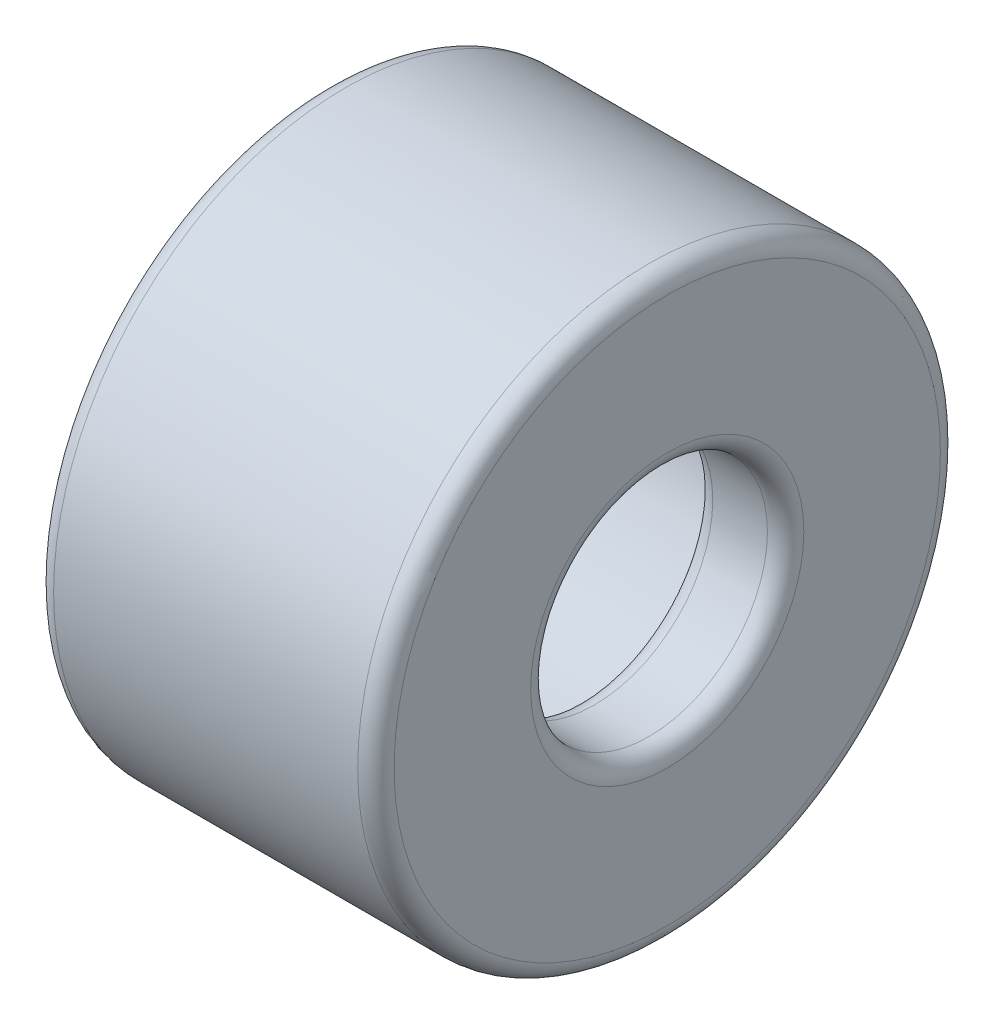
ISO-10303-21;
HEADER;
FILE_DESCRIPTION(('STEP AP214'),'2;1');
FILE_NAME('part.step','',(''),(''),'','','');
FILE_SCHEMA(('AUTOMOTIVE_DESIGN { 1 0 10303 214 1 1 1 1 }'));
ENDSEC;
DATA;
#1=APPLICATION_CONTEXT('core data for automotive mechanical design processes');
#2=APPLICATION_PROTOCOL_DEFINITION('international standard','automotive_design',2000,#1);
#3=PRODUCT_CONTEXT('',#1,'mechanical');
#4=PRODUCT('Part','Part','',(#3));
#5=PRODUCT_RELATED_PRODUCT_CATEGORY('part','',(#4));
#6=PRODUCT_DEFINITION_FORMATION('','',#4);
#7=PRODUCT_DEFINITION_CONTEXT('part definition',#1,'design');
#8=PRODUCT_DEFINITION('design','',#6,#7);
#9=PRODUCT_DEFINITION_SHAPE('','',#8);
#10=(LENGTH_UNIT() NAMED_UNIT(*) SI_UNIT(.MILLI.,.METRE.));
#11=(NAMED_UNIT(*) PLANE_ANGLE_UNIT() SI_UNIT($,.RADIAN.));
#12=(NAMED_UNIT(*) SI_UNIT($,.STERADIAN.) SOLID_ANGLE_UNIT());
#13=UNCERTAINTY_MEASURE_WITH_UNIT(LENGTH_MEASURE(1.E-05),#10,'distance_accuracy_value','');
#14=(GEOMETRIC_REPRESENTATION_CONTEXT(3) GLOBAL_UNCERTAINTY_ASSIGNED_CONTEXT((#13)) GLOBAL_UNIT_ASSIGNED_CONTEXT((#10,
#11,#12)) REPRESENTATION_CONTEXT('',''));
#15=CARTESIAN_POINT('',(0.,0.,0.));
#16=DIRECTION('',(0.,0.,1.));
#17=DIRECTION('',(1.,0.,0.));
#18=AXIS2_PLACEMENT_3D('',#15,#16,#17);
#19=CARTESIAN_POINT('',(-1.17432348671967,0.,0.));
#20=DIRECTION('',(-1.,0.,0.));
#21=DIRECTION('',(0.,0.,1.));
#22=AXIS2_PLACEMENT_3D('',#19,#20,#21);
#23=CYLINDRICAL_SURFACE('',#22,5.15000000000001);
#24=CARTESIAN_POINT('',(5.15,0.,0.));
#25=DIRECTION('',(-1.,0.,0.));
#26=DIRECTION('',(0.,0.,1.));
#27=AXIS2_PLACEMENT_3D('',#24,#25,#26);
#28=CIRCLE('',#27,5.15000000000001);
#29=CARTESIAN_POINT('',(5.15,0.,5.15000000000001));
#30=VERTEX_POINT('',#29);
#31=EDGE_CURVE('E44',#30,#30,#28,.T.);
#32=ORIENTED_EDGE('',*,*,#31,.T.);
#33=EDGE_LOOP('',(#32));
#34=FACE_BOUND('',#33,.T.);
#35=CARTESIAN_POINT('',(11.5,0.,0.));
#36=DIRECTION('',(-1.,0.,0.));
#37=DIRECTION('',(0.,0.,1.));
#38=AXIS2_PLACEMENT_3D('',#35,#36,#37);
#39=CIRCLE('',#38,5.15000000000001);
#40=CARTESIAN_POINT('',(11.5,0.,5.15000000000001));
#41=VERTEX_POINT('',#40);
#42=EDGE_CURVE('E71',#41,#41,#39,.T.);
#43=ORIENTED_EDGE('',*,*,#42,.F.);
#44=EDGE_LOOP('',(#43));
#45=FACE_BOUND('',#44,.T.);
#46=ADVANCED_FACE('F33',(#34,#45),#23,.F.);
#47=CARTESIAN_POINT('',(11.5,0.,0.));
#48=DIRECTION('',(-1.,0.,0.));
#49=DIRECTION('',(0.,0.,1.));
#50=AXIS2_PLACEMENT_3D('',#47,#48,#49);
#51=PLANE('',#50);
#52=CARTESIAN_POINT('',(11.5,0.,0.));
#53=DIRECTION('',(-1.,0.,0.));
#54=DIRECTION('',(0.,0.,1.));
#55=AXIS2_PLACEMENT_3D('',#52,#53,#54);
#56=CIRCLE('',#55,3.75);
#57=CARTESIAN_POINT('',(11.5,0.,3.75));
#58=VERTEX_POINT('',#57);
#59=EDGE_CURVE('E48',#58,#58,#56,.F.);
#60=ORIENTED_EDGE('',*,*,#59,.T.);
#61=EDGE_LOOP('',(#60));
#62=FACE_BOUND('',#61,.T.);
#63=ORIENTED_EDGE('',*,*,#42,.T.);
#64=EDGE_LOOP('',(#63));
#65=FACE_BOUND('',#64,.T.);
#66=ADVANCED_FACE('F75',(#62,#65),#51,.T.);
#67=CARTESIAN_POINT('',(14.,0.,0.));
#68=DIRECTION('',(1.,0.,0.));
#69=DIRECTION('',(0.,0.,-1.));
#70=AXIS2_PLACEMENT_3D('',#67,#68,#69);
#71=PLANE('',#70);
#72=CARTESIAN_POINT('',(14.,0.,0.));
#73=DIRECTION('',(1.,0.,0.));
#74=DIRECTION('',(0.,0.,-1.));
#75=AXIS2_PLACEMENT_3D('',#72,#73,#74);
#76=CIRCLE('',#75,7.5);
#77=CARTESIAN_POINT('',(14.,0.,-7.5));
#78=VERTEX_POINT('',#77);
#79=EDGE_CURVE('E59',#78,#78,#76,.T.);
#80=ORIENTED_EDGE('',*,*,#79,.T.);
#81=EDGE_LOOP('',(#80));
#82=FACE_BOUND('',#81,.T.);
#83=CARTESIAN_POINT('',(14.,0.,0.));
#84=DIRECTION('',(1.,0.,0.));
#85=DIRECTION('',(0.,0.,-1.));
#86=AXIS2_PLACEMENT_3D('',#83,#84,#85);
#87=CIRCLE('',#86,3.75);
#88=CARTESIAN_POINT('',(14.,0.,-3.75));
#89=VERTEX_POINT('',#88);
#90=EDGE_CURVE('E62',#89,#89,#87,.F.);
#91=ORIENTED_EDGE('',*,*,#90,.T.);
#92=EDGE_LOOP('',(#91));
#93=FACE_BOUND('',#92,.T.);
#94=ADVANCED_FACE('F83',(#82,#93),#71,.T.);
#95=CARTESIAN_POINT('',(-1.17432348671967,0.,0.));
#96=DIRECTION('',(-1.,0.,0.));
#97=DIRECTION('',(0.,0.,1.));
#98=AXIS2_PLACEMENT_3D('',#95,#96,#97);
#99=CYLINDRICAL_SURFACE('',#98,8.);
#100=CARTESIAN_POINT('',(13.5,0.,0.));
#101=DIRECTION('',(1.,0.,0.));
#102=DIRECTION('',(0.,0.,-1.));
#103=AXIS2_PLACEMENT_3D('',#100,#101,#102);
#104=CIRCLE('',#103,8.);
#105=CARTESIAN_POINT('',(13.5,0.,-8.));
#106=VERTEX_POINT('',#105);
#107=EDGE_CURVE('E65',#106,#106,#104,.F.);
#108=ORIENTED_EDGE('',*,*,#107,.T.);
#109=EDGE_LOOP('',(#108));
#110=FACE_BOUND('',#109,.T.);
#111=CARTESIAN_POINT('',(5.15,0.,0.));
#112=DIRECTION('',(-1.,0.,0.));
#113=DIRECTION('',(0.,0.,1.));
#114=AXIS2_PLACEMENT_3D('',#111,#112,#113);
#115=CIRCLE('',#114,8.);
#116=CARTESIAN_POINT('',(5.15,0.,8.));
#117=VERTEX_POINT('',#116);
#118=EDGE_CURVE('E68',#117,#117,#115,.F.);
#119=ORIENTED_EDGE('',*,*,#118,.T.);
#120=EDGE_LOOP('',(#119));
#121=FACE_BOUND('',#120,.T.);
#122=ADVANCED_FACE('F114',(#110,#121),#99,.T.);
#123=CARTESIAN_POINT('',(4.65,0.,0.));
#124=DIRECTION('',(-1.,0.,0.));
#125=DIRECTION('',(0.,0.,1.));
#126=AXIS2_PLACEMENT_3D('',#123,#124,#125);
#127=PLANE('',#126);
#128=CARTESIAN_POINT('',(4.65,0.,0.));
#129=DIRECTION('',(-1.,0.,0.));
#130=DIRECTION('',(0.,0.,1.));
#131=AXIS2_PLACEMENT_3D('',#128,#129,#130);
#132=CIRCLE('',#131,5.65000000000001);
#133=CARTESIAN_POINT('',(4.65,0.,5.65000000000001));
#134=VERTEX_POINT('',#133);
#135=EDGE_CURVE('E10',#134,#134,#132,.F.);
#136=ORIENTED_EDGE('',*,*,#135,.T.);
#137=EDGE_LOOP('',(#136));
#138=FACE_BOUND('',#137,.T.);
#139=CARTESIAN_POINT('',(4.65,0.,0.));
#140=DIRECTION('',(-1.,0.,0.));
#141=DIRECTION('',(0.,0.,1.));
#142=AXIS2_PLACEMENT_3D('',#139,#140,#141);
#143=CIRCLE('',#142,7.5);
#144=CARTESIAN_POINT('',(4.65,0.,7.5));
#145=VERTEX_POINT('',#144);
#146=EDGE_CURVE('E40',#145,#145,#143,.T.);
#147=ORIENTED_EDGE('',*,*,#146,.T.);
#148=EDGE_LOOP('',(#147));
#149=FACE_BOUND('',#148,.T.);
#150=ADVANCED_FACE('F116',(#138,#149),#127,.T.);
#151=CARTESIAN_POINT('',(4.65,0.,0.));
#152=DIRECTION('',(-1.,0.,0.));
#153=DIRECTION('',(0.,0.,1.));
#154=AXIS2_PLACEMENT_3D('',#151,#152,#153);
#155=CYLINDRICAL_SURFACE('',#154,3.25);
#156=CARTESIAN_POINT('',(13.5,0.,0.));
#157=DIRECTION('',(1.,0.,0.));
#158=DIRECTION('',(0.,0.,-1.));
#159=AXIS2_PLACEMENT_3D('',#156,#157,#158);
#160=CIRCLE('',#159,3.25);
#161=CARTESIAN_POINT('',(13.5,0.,-3.25));
#162=VERTEX_POINT('',#161);
#163=EDGE_CURVE('E53',#162,#162,#160,.T.);
#164=ORIENTED_EDGE('',*,*,#163,.T.);
#165=EDGE_LOOP('',(#164));
#166=FACE_BOUND('',#165,.T.);
#167=CARTESIAN_POINT('',(12.,0.,0.));
#168=DIRECTION('',(-1.,0.,0.));
#169=DIRECTION('',(0.,0.,1.));
#170=AXIS2_PLACEMENT_3D('',#167,#168,#169);
#171=CIRCLE('',#170,3.25);
#172=CARTESIAN_POINT('',(12.,0.,3.25));
#173=VERTEX_POINT('',#172);
#174=EDGE_CURVE('E56',#173,#173,#171,.T.);
#175=ORIENTED_EDGE('',*,*,#174,.T.);
#176=EDGE_LOOP('',(#175));
#177=FACE_BOUND('',#176,.T.);
#178=ADVANCED_FACE('F92',(#166,#177),#155,.F.);
#179=CARTESIAN_POINT('',(13.5,0.,0.));
#180=DIRECTION('',(1.,0.,0.));
#181=DIRECTION('',(0.,0.,-1.));
#182=AXIS2_PLACEMENT_3D('',#179,#180,#181);
#183=TOROIDAL_SURFACE('',#182,7.5,0.5);
#184=ORIENTED_EDGE('',*,*,#79,.F.);
#185=EDGE_LOOP('',(#184));
#186=FACE_BOUND('',#185,.T.);
#187=ORIENTED_EDGE('',*,*,#107,.F.);
#188=EDGE_LOOP('',(#187));
#189=FACE_BOUND('',#188,.T.);
#190=ADVANCED_FACE('F88',(#186,#189),#183,.T.);
#191=CARTESIAN_POINT('',(13.5,0.,0.));
#192=DIRECTION('',(1.,0.,0.));
#193=DIRECTION('',(0.,0.,-1.));
#194=AXIS2_PLACEMENT_3D('',#191,#192,#193);
#195=TOROIDAL_SURFACE('',#194,3.75,0.5);
#196=ORIENTED_EDGE('',*,*,#90,.F.);
#197=EDGE_LOOP('',(#196));
#198=FACE_BOUND('',#197,.T.);
#199=ORIENTED_EDGE('',*,*,#163,.F.);
#200=EDGE_LOOP('',(#199));
#201=FACE_BOUND('',#200,.T.);
#202=ADVANCED_FACE('F91',(#198,#201),#195,.T.);
#203=CARTESIAN_POINT('',(12.,0.,0.));
#204=DIRECTION('',(-1.,0.,0.));
#205=DIRECTION('',(0.,0.,1.));
#206=AXIS2_PLACEMENT_3D('',#203,#204,#205);
#207=TOROIDAL_SURFACE('',#206,3.75,0.5);
#208=ORIENTED_EDGE('',*,*,#174,.F.);
#209=EDGE_LOOP('',(#208));
#210=FACE_BOUND('',#209,.T.);
#211=ORIENTED_EDGE('',*,*,#59,.F.);
#212=EDGE_LOOP('',(#211));
#213=FACE_BOUND('',#212,.T.);
#214=ADVANCED_FACE('F96',(#210,#213),#207,.T.);
#215=CARTESIAN_POINT('',(5.15,0.,0.));
#216=DIRECTION('',(-1.,0.,0.));
#217=DIRECTION('',(0.,0.,1.));
#218=AXIS2_PLACEMENT_3D('',#215,#216,#217);
#219=TOROIDAL_SURFACE('',#218,5.65000000000001,0.5);
#220=ORIENTED_EDGE('',*,*,#135,.F.);
#221=EDGE_LOOP('',(#220));
#222=FACE_BOUND('',#221,.T.);
#223=ORIENTED_EDGE('',*,*,#31,.F.);
#224=EDGE_LOOP('',(#223));
#225=FACE_BOUND('',#224,.T.);
#226=ADVANCED_FACE('F99',(#222,#225),#219,.T.);
#227=CARTESIAN_POINT('',(5.15,0.,0.));
#228=DIRECTION('',(-1.,0.,0.));
#229=DIRECTION('',(0.,0.,1.));
#230=AXIS2_PLACEMENT_3D('',#227,#228,#229);
#231=TOROIDAL_SURFACE('',#230,7.5,0.5);
#232=ORIENTED_EDGE('',*,*,#118,.F.);
#233=EDGE_LOOP('',(#232));
#234=FACE_BOUND('',#233,.T.);
#235=ORIENTED_EDGE('',*,*,#146,.F.);
#236=EDGE_LOOP('',(#235));
#237=FACE_BOUND('',#236,.T.);
#238=ADVANCED_FACE('F35',(#234,#237),#231,.T.);
#239=CLOSED_SHELL('',(#46,#66,#94,#122,#150,#178,#190,#202,#214,#226,#238));
#240=MANIFOLD_SOLID_BREP('B2',#239);
#241=ADVANCED_BREP_SHAPE_REPRESENTATION('',(#18,#240),#14);
#242=SHAPE_DEFINITION_REPRESENTATION(#9,#241);
ENDSEC;
END-ISO-10303-21;
